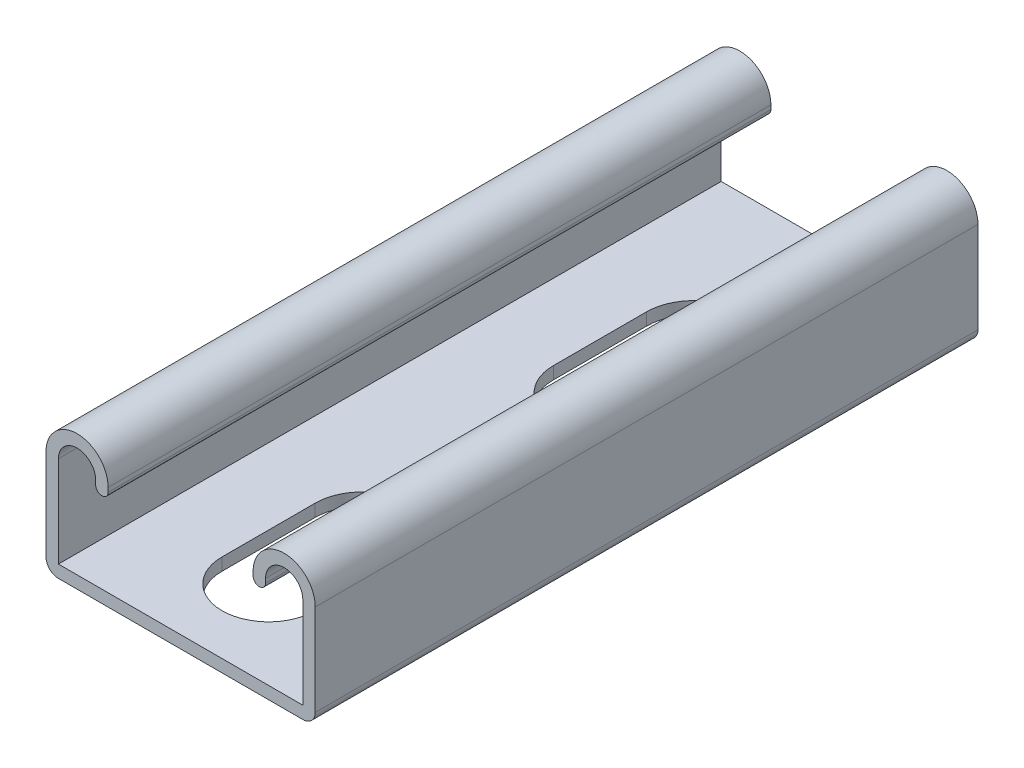
ISO-10303-21;
HEADER;
FILE_DESCRIPTION(('STEP AP214'),'2;1');
FILE_NAME('part.step','',(''),(''),'','','');
FILE_SCHEMA(('AUTOMOTIVE_DESIGN { 1 0 10303 214 1 1 1 1 }'));
ENDSEC;
DATA;
#1=APPLICATION_CONTEXT('core data for automotive mechanical design processes');
#2=APPLICATION_PROTOCOL_DEFINITION('international standard','automotive_design',2000,#1);
#3=PRODUCT_CONTEXT('',#1,'mechanical');
#4=PRODUCT('Part','Part','',(#3));
#5=PRODUCT_RELATED_PRODUCT_CATEGORY('part','',(#4));
#6=PRODUCT_DEFINITION_FORMATION('','',#4);
#7=PRODUCT_DEFINITION_CONTEXT('part definition',#1,'design');
#8=PRODUCT_DEFINITION('design','',#6,#7);
#9=PRODUCT_DEFINITION_SHAPE('','',#8);
#10=(LENGTH_UNIT() NAMED_UNIT(*) SI_UNIT(.MILLI.,.METRE.));
#11=(NAMED_UNIT(*) PLANE_ANGLE_UNIT() SI_UNIT($,.RADIAN.));
#12=(NAMED_UNIT(*) SI_UNIT($,.STERADIAN.) SOLID_ANGLE_UNIT());
#13=UNCERTAINTY_MEASURE_WITH_UNIT(LENGTH_MEASURE(1.E-05),#10,'distance_accuracy_value','');
#14=(GEOMETRIC_REPRESENTATION_CONTEXT(3) GLOBAL_UNCERTAINTY_ASSIGNED_CONTEXT((#13)) GLOBAL_UNIT_ASSIGNED_CONTEXT((#10,
#11,#12)) REPRESENTATION_CONTEXT('',''));
#15=CARTESIAN_POINT('',(0.,0.,0.));
#16=DIRECTION('',(0.,0.,1.));
#17=DIRECTION('',(1.,0.,0.));
#18=AXIS2_PLACEMENT_3D('',#15,#16,#17);
#19=CARTESIAN_POINT('',(-15.875,7.4295,101.6));
#20=DIRECTION('',(0.,0.,-1.));
#21=DIRECTION('',(-1.,0.,0.));
#22=AXIS2_PLACEMENT_3D('',#19,#20,#21);
#23=CYLINDRICAL_SURFACE('',#22,4.7625);
#24=CARTESIAN_POINT('',(-15.875,7.4295,0.));
#25=DIRECTION('',(0.,0.,1.));
#26=DIRECTION('',(-1.,0.,0.));
#27=AXIS2_PLACEMENT_3D('',#24,#25,#26);
#28=CIRCLE('',#27,4.7625);
#29=CARTESIAN_POINT('',(-11.1125,7.4295,0.));
#30=VERTEX_POINT('',#29);
#31=CARTESIAN_POINT('',(-20.6375,7.4295,0.));
#32=VERTEX_POINT('',#31);
#33=EDGE_CURVE('E253',#30,#32,#28,.T.);
#34=ORIENTED_EDGE('',*,*,#33,.T.);
#35=DIRECTION('',(0.,0.,-1.));
#36=VECTOR('',#35,1.);
#37=CARTESIAN_POINT('',(-20.6375,7.4295,101.6));
#38=LINE('',#37,#36);
#39=CARTESIAN_POINT('',(-20.6375,7.4295,101.6));
#40=VERTEX_POINT('',#39);
#41=EDGE_CURVE('E384',#40,#32,#38,.T.);
#42=ORIENTED_EDGE('',*,*,#41,.F.);
#43=CARTESIAN_POINT('',(-15.875,7.4295,101.6));
#44=DIRECTION('',(0.,0.,1.));
#45=DIRECTION('',(-1.,0.,0.));
#46=AXIS2_PLACEMENT_3D('',#43,#44,#45);
#47=CIRCLE('',#46,4.7625);
#48=CARTESIAN_POINT('',(-11.1125,7.4295,101.6));
#49=VERTEX_POINT('',#48);
#50=EDGE_CURVE('E260',#49,#40,#47,.T.);
#51=ORIENTED_EDGE('',*,*,#50,.F.);
#52=DIRECTION('',(0.,0.,-1.));
#53=VECTOR('',#52,1.);
#54=CARTESIAN_POINT('',(-11.1125,7.4295,101.6));
#55=LINE('',#54,#53);
#56=EDGE_CURVE('E298',#49,#30,#55,.T.);
#57=ORIENTED_EDGE('',*,*,#56,.T.);
#58=EDGE_LOOP('',(#34,#42,#51,#57));
#59=FACE_BOUND('',#58,.T.);
#60=ADVANCED_FACE('F32',(#59),#23,.T.);
#61=CARTESIAN_POINT('',(-20.6375,7.4295,101.6));
#62=DIRECTION('',(1.,0.,0.));
#63=DIRECTION('',(0.,0.,-1.));
#64=AXIS2_PLACEMENT_3D('',#61,#62,#63);
#65=PLANE('',#64);
#66=DIRECTION('',(0.,-1.,0.));
#67=VECTOR('',#66,1.);
#68=CARTESIAN_POINT('',(-20.6375,7.4295,0.));
#69=LINE('',#68,#67);
#70=CARTESIAN_POINT('',(-20.6375,-6.5532,0.));
#71=VERTEX_POINT('',#70);
#72=EDGE_CURVE('E301',#32,#71,#69,.T.);
#73=ORIENTED_EDGE('',*,*,#72,.T.);
#74=DIRECTION('',(0.,0.,-1.));
#75=VECTOR('',#74,1.);
#76=CARTESIAN_POINT('',(-20.6375,-6.5532,101.6));
#77=LINE('',#76,#75);
#78=CARTESIAN_POINT('',(-20.6375,-6.5532,101.6));
#79=VERTEX_POINT('',#78);
#80=EDGE_CURVE('E381',#79,#71,#77,.T.);
#81=ORIENTED_EDGE('',*,*,#80,.F.);
#82=DIRECTION('',(0.,-1.,0.));
#83=VECTOR('',#82,1.);
#84=CARTESIAN_POINT('',(-20.6375,7.4295,101.6));
#85=LINE('',#84,#83);
#86=EDGE_CURVE('E263',#40,#79,#85,.T.);
#87=ORIENTED_EDGE('',*,*,#86,.F.);
#88=ORIENTED_EDGE('',*,*,#41,.T.);
#89=EDGE_LOOP('',(#73,#81,#87,#88));
#90=FACE_BOUND('',#89,.T.);
#91=ADVANCED_FACE('F425',(#90),#65,.F.);
#92=CARTESIAN_POINT('',(-18.7325,-6.5532,101.6));
#93=DIRECTION('',(0.,0.,-1.));
#94=DIRECTION('',(-1.,0.,0.));
#95=AXIS2_PLACEMENT_3D('',#92,#93,#94);
#96=CYLINDRICAL_SURFACE('',#95,1.905);
#97=CARTESIAN_POINT('',(-18.7325,-6.5532,0.));
#98=DIRECTION('',(0.,0.,1.));
#99=DIRECTION('',(-1.,0.,0.));
#100=AXIS2_PLACEMENT_3D('',#97,#98,#99);
#101=CIRCLE('',#100,1.905);
#102=CARTESIAN_POINT('',(-18.7325,-8.4582,0.));
#103=VERTEX_POINT('',#102);
#104=EDGE_CURVE('E303',#71,#103,#101,.T.);
#105=ORIENTED_EDGE('',*,*,#104,.T.);
#106=DIRECTION('',(0.,0.,-1.));
#107=VECTOR('',#106,1.);
#108=CARTESIAN_POINT('',(-18.7325,-8.4582,101.6));
#109=LINE('',#108,#107);
#110=CARTESIAN_POINT('',(-18.7325,-8.4582,101.6));
#111=VERTEX_POINT('',#110);
#112=EDGE_CURVE('E378',#111,#103,#109,.T.);
#113=ORIENTED_EDGE('',*,*,#112,.F.);
#114=CARTESIAN_POINT('',(-18.7325,-6.5532,101.6));
#115=DIRECTION('',(0.,0.,1.));
#116=DIRECTION('',(-1.,0.,0.));
#117=AXIS2_PLACEMENT_3D('',#114,#115,#116);
#118=CIRCLE('',#117,1.905);
#119=EDGE_CURVE('E266',#79,#111,#118,.T.);
#120=ORIENTED_EDGE('',*,*,#119,.F.);
#121=ORIENTED_EDGE('',*,*,#80,.T.);
#122=EDGE_LOOP('',(#105,#113,#120,#121));
#123=FACE_BOUND('',#122,.T.);
#124=ADVANCED_FACE('F430',(#123),#96,.T.);
#125=CARTESIAN_POINT('',(-18.7325,-8.4582,101.6));
#126=DIRECTION('',(0.,1.,0.));
#127=DIRECTION('',(0.,0.,1.));
#128=AXIS2_PLACEMENT_3D('',#125,#126,#127);
#129=PLANE('',#128);
#130=DIRECTION('',(0.,0.,-1.));
#131=VECTOR('',#130,1.);
#132=CARTESIAN_POINT('',(-7.14375,-8.45820000000685,73.81875));
#133=LINE('',#132,#131);
#134=CARTESIAN_POINT('',(-7.14375,-8.4582,88.10625));
#135=VERTEX_POINT('',#134);
#136=CARTESIAN_POINT('',(-7.14375,-8.45820000000685,73.81875));
#137=VERTEX_POINT('',#136);
#138=EDGE_CURVE('E206',#135,#137,#133,.T.);
#139=ORIENTED_EDGE('',*,*,#138,.F.);
#140=CARTESIAN_POINT('',(0.,-8.45820000000685,88.10625));
#141=DIRECTION('',(0.,-1.,0.));
#142=DIRECTION('',(0.,0.,-1.));
#143=AXIS2_PLACEMENT_3D('',#140,#141,#142);
#144=CIRCLE('',#143,7.14375);
#145=CARTESIAN_POINT('',(7.14375,-8.45820000000685,88.10625));
#146=VERTEX_POINT('',#145);
#147=EDGE_CURVE('E46',#146,#135,#144,.T.);
#148=ORIENTED_EDGE('',*,*,#147,.F.);
#149=DIRECTION('',(0.,0.,1.));
#150=VECTOR('',#149,1.);
#151=CARTESIAN_POINT('',(7.14375,-8.45820000000685,88.10625));
#152=LINE('',#151,#150);
#153=CARTESIAN_POINT('',(7.14375,-8.45820000000685,73.81875));
#154=VERTEX_POINT('',#153);
#155=EDGE_CURVE('E222',#154,#146,#152,.T.);
#156=ORIENTED_EDGE('',*,*,#155,.F.);
#157=CARTESIAN_POINT('',(0.,-8.45820000000685,73.81875));
#158=DIRECTION('',(0.,-1.,0.));
#159=DIRECTION('',(0.,0.,-1.));
#160=AXIS2_PLACEMENT_3D('',#157,#158,#159);
#161=CIRCLE('',#160,7.14375);
#162=EDGE_CURVE('E216',#137,#154,#161,.T.);
#163=ORIENTED_EDGE('',*,*,#162,.F.);
#164=EDGE_LOOP('',(#139,#148,#156,#163));
#165=FACE_BOUND('',#164,.T.);
#166=DIRECTION('',(0.,0.,-1.));
#167=VECTOR('',#166,1.);
#168=CARTESIAN_POINT('',(-7.14375,-8.45820000000685,23.01875));
#169=LINE('',#168,#167);
#170=CARTESIAN_POINT('',(-7.14375,-8.4582,37.30625));
#171=VERTEX_POINT('',#170);
#172=CARTESIAN_POINT('',(-7.14375,-8.45820000000685,23.01875));
#173=VERTEX_POINT('',#172);
#174=EDGE_CURVE('E241',#171,#173,#169,.T.);
#175=ORIENTED_EDGE('',*,*,#174,.F.);
#176=CARTESIAN_POINT('',(0.,-8.45820000000685,37.30625));
#177=DIRECTION('',(0.,-1.,0.));
#178=DIRECTION('',(0.,0.,-1.));
#179=AXIS2_PLACEMENT_3D('',#176,#177,#178);
#180=CIRCLE('',#179,7.14375);
#181=CARTESIAN_POINT('',(7.14375,-8.45820000000685,37.30625));
#182=VERTEX_POINT('',#181);
#183=EDGE_CURVE('E239',#182,#171,#180,.T.);
#184=ORIENTED_EDGE('',*,*,#183,.F.);
#185=DIRECTION('',(0.,0.,1.));
#186=VECTOR('',#185,1.);
#187=CARTESIAN_POINT('',(7.14375,-8.45820000000685,37.30625));
#188=LINE('',#187,#186);
#189=CARTESIAN_POINT('',(7.14375,-8.45820000000685,23.01875));
#190=VERTEX_POINT('',#189);
#191=EDGE_CURVE('E247',#190,#182,#188,.T.);
#192=ORIENTED_EDGE('',*,*,#191,.F.);
#193=CARTESIAN_POINT('',(0.,-8.45820000000685,23.01875));
#194=DIRECTION('',(0.,-1.,0.));
#195=DIRECTION('',(0.,0.,-1.));
#196=AXIS2_PLACEMENT_3D('',#193,#194,#195);
#197=CIRCLE('',#196,7.14375);
#198=EDGE_CURVE('E244',#173,#190,#197,.T.);
#199=ORIENTED_EDGE('',*,*,#198,.F.);
#200=EDGE_LOOP('',(#175,#184,#192,#199));
#201=FACE_BOUND('',#200,.T.);
#202=DIRECTION('',(1.,0.,0.));
#203=VECTOR('',#202,1.);
#204=CARTESIAN_POINT('',(-18.7325,-8.4582,0.));
#205=LINE('',#204,#203);
#206=CARTESIAN_POINT('',(18.7325,-8.4582,0.));
#207=VERTEX_POINT('',#206);
#208=EDGE_CURVE('E305',#103,#207,#205,.T.);
#209=ORIENTED_EDGE('',*,*,#208,.T.);
#210=DIRECTION('',(0.,0.,-1.));
#211=VECTOR('',#210,1.);
#212=CARTESIAN_POINT('',(18.7325,-8.4582,101.6));
#213=LINE('',#212,#211);
#214=CARTESIAN_POINT('',(18.7325,-8.4582,101.6));
#215=VERTEX_POINT('',#214);
#216=EDGE_CURVE('E375',#215,#207,#213,.T.);
#217=ORIENTED_EDGE('',*,*,#216,.F.);
#218=DIRECTION('',(1.,0.,0.));
#219=VECTOR('',#218,1.);
#220=CARTESIAN_POINT('',(-18.7325,-8.4582,101.6));
#221=LINE('',#220,#219);
#222=EDGE_CURVE('E268',#111,#215,#221,.T.);
#223=ORIENTED_EDGE('',*,*,#222,.F.);
#224=ORIENTED_EDGE('',*,*,#112,.T.);
#225=EDGE_LOOP('',(#209,#217,#223,#224));
#226=FACE_BOUND('',#225,.T.);
#227=ADVANCED_FACE('F220',(#165,#201,#226),#129,.F.);
#228=CARTESIAN_POINT('',(18.7325,-6.5532,101.6));
#229=DIRECTION('',(0.,0.,-1.));
#230=DIRECTION('',(-1.,0.,0.));
#231=AXIS2_PLACEMENT_3D('',#228,#229,#230);
#232=CYLINDRICAL_SURFACE('',#231,1.905);
#233=CARTESIAN_POINT('',(18.7325,-6.5532,0.));
#234=DIRECTION('',(0.,0.,1.));
#235=DIRECTION('',(1.,0.,0.));
#236=AXIS2_PLACEMENT_3D('',#233,#234,#235);
#237=CIRCLE('',#236,1.905);
#238=CARTESIAN_POINT('',(20.6375,-6.5532,0.));
#239=VERTEX_POINT('',#238);
#240=EDGE_CURVE('E307',#207,#239,#237,.T.);
#241=ORIENTED_EDGE('',*,*,#240,.T.);
#242=DIRECTION('',(0.,0.,-1.));
#243=VECTOR('',#242,1.);
#244=CARTESIAN_POINT('',(20.6375,-6.5532,101.6));
#245=LINE('',#244,#243);
#246=CARTESIAN_POINT('',(20.6375,-6.5532,101.6));
#247=VERTEX_POINT('',#246);
#248=EDGE_CURVE('E372',#247,#239,#245,.T.);
#249=ORIENTED_EDGE('',*,*,#248,.F.);
#250=CARTESIAN_POINT('',(18.7325,-6.5532,101.6));
#251=DIRECTION('',(0.,0.,1.));
#252=DIRECTION('',(1.,0.,0.));
#253=AXIS2_PLACEMENT_3D('',#250,#251,#252);
#254=CIRCLE('',#253,1.905);
#255=EDGE_CURVE('E270',#215,#247,#254,.T.);
#256=ORIENTED_EDGE('',*,*,#255,.F.);
#257=ORIENTED_EDGE('',*,*,#216,.T.);
#258=EDGE_LOOP('',(#241,#249,#256,#257));
#259=FACE_BOUND('',#258,.T.);
#260=ADVANCED_FACE('F510',(#259),#232,.T.);
#261=CARTESIAN_POINT('',(20.6375,-6.5532,101.6));
#262=DIRECTION('',(-1.,0.,0.));
#263=DIRECTION('',(0.,-1.,0.));
#264=AXIS2_PLACEMENT_3D('',#261,#262,#263);
#265=PLANE('',#264);
#266=DIRECTION('',(0.,1.,0.));
#267=VECTOR('',#266,1.);
#268=CARTESIAN_POINT('',(20.6375,-6.5532,0.));
#269=LINE('',#268,#267);
#270=CARTESIAN_POINT('',(20.6375,7.4295,0.));
#271=VERTEX_POINT('',#270);
#272=EDGE_CURVE('E309',#239,#271,#269,.T.);
#273=ORIENTED_EDGE('',*,*,#272,.T.);
#274=DIRECTION('',(0.,0.,-1.));
#275=VECTOR('',#274,1.);
#276=CARTESIAN_POINT('',(20.6375,7.4295,101.6));
#277=LINE('',#276,#275);
#278=CARTESIAN_POINT('',(20.6375,7.4295,101.6));
#279=VERTEX_POINT('',#278);
#280=EDGE_CURVE('E369',#279,#271,#277,.T.);
#281=ORIENTED_EDGE('',*,*,#280,.F.);
#282=DIRECTION('',(0.,1.,0.));
#283=VECTOR('',#282,1.);
#284=CARTESIAN_POINT('',(20.6375,-6.5532,101.6));
#285=LINE('',#284,#283);
#286=EDGE_CURVE('E272',#247,#279,#285,.T.);
#287=ORIENTED_EDGE('',*,*,#286,.F.);
#288=ORIENTED_EDGE('',*,*,#248,.T.);
#289=EDGE_LOOP('',(#273,#281,#287,#288));
#290=FACE_BOUND('',#289,.T.);
#291=ADVANCED_FACE('F506',(#290),#265,.F.);
#292=CARTESIAN_POINT('',(15.875,7.4295,101.6));
#293=DIRECTION('',(0.,0.,-1.));
#294=DIRECTION('',(-1.,0.,0.));
#295=AXIS2_PLACEMENT_3D('',#292,#293,#294);
#296=CYLINDRICAL_SURFACE('',#295,4.7625);
#297=CARTESIAN_POINT('',(15.875,7.4295,0.));
#298=DIRECTION('',(0.,0.,1.));
#299=DIRECTION('',(1.,0.,0.));
#300=AXIS2_PLACEMENT_3D('',#297,#298,#299);
#301=CIRCLE('',#300,4.7625);
#302=CARTESIAN_POINT('',(11.1125,7.4295,0.));
#303=VERTEX_POINT('',#302);
#304=EDGE_CURVE('E311',#271,#303,#301,.T.);
#305=ORIENTED_EDGE('',*,*,#304,.T.);
#306=DIRECTION('',(0.,0.,-1.));
#307=VECTOR('',#306,1.);
#308=CARTESIAN_POINT('',(11.1125,7.4295,101.6));
#309=LINE('',#308,#307);
#310=CARTESIAN_POINT('',(11.1125,7.4295,101.6));
#311=VERTEX_POINT('',#310);
#312=EDGE_CURVE('E366',#311,#303,#309,.T.);
#313=ORIENTED_EDGE('',*,*,#312,.F.);
#314=CARTESIAN_POINT('',(15.875,7.4295,101.6));
#315=DIRECTION('',(0.,0.,1.));
#316=DIRECTION('',(1.,0.,0.));
#317=AXIS2_PLACEMENT_3D('',#314,#315,#316);
#318=CIRCLE('',#317,4.7625);
#319=EDGE_CURVE('E274',#279,#311,#318,.T.);
#320=ORIENTED_EDGE('',*,*,#319,.F.);
#321=ORIENTED_EDGE('',*,*,#280,.T.);
#322=EDGE_LOOP('',(#305,#313,#320,#321));
#323=FACE_BOUND('',#322,.T.);
#324=ADVANCED_FACE('F501',(#323),#296,.T.);
#325=CARTESIAN_POINT('',(11.1125,7.4295,101.6));
#326=DIRECTION('',(1.,0.,0.));
#327=DIRECTION('',(0.,1.,0.));
#328=AXIS2_PLACEMENT_3D('',#325,#326,#327);
#329=PLANE('',#328);
#330=DIRECTION('',(0.,-1.,0.));
#331=VECTOR('',#330,1.);
#332=CARTESIAN_POINT('',(11.1125,7.4295,0.));
#333=LINE('',#332,#331);
#334=CARTESIAN_POINT('',(11.1125,6.7945,0.));
#335=VERTEX_POINT('',#334);
#336=EDGE_CURVE('E313',#303,#335,#333,.T.);
#337=ORIENTED_EDGE('',*,*,#336,.T.);
#338=DIRECTION('',(0.,0.,-1.));
#339=VECTOR('',#338,1.);
#340=CARTESIAN_POINT('',(11.1125,6.7945,101.6));
#341=LINE('',#340,#339);
#342=CARTESIAN_POINT('',(11.1125,6.7945,101.6));
#343=VERTEX_POINT('',#342);
#344=EDGE_CURVE('E363',#343,#335,#341,.T.);
#345=ORIENTED_EDGE('',*,*,#344,.F.);
#346=DIRECTION('',(0.,-1.,0.));
#347=VECTOR('',#346,1.);
#348=CARTESIAN_POINT('',(11.1125,7.4295,101.6));
#349=LINE('',#348,#347);
#350=EDGE_CURVE('E276',#311,#343,#349,.T.);
#351=ORIENTED_EDGE('',*,*,#350,.F.);
#352=ORIENTED_EDGE('',*,*,#312,.T.);
#353=EDGE_LOOP('',(#337,#345,#351,#352));
#354=FACE_BOUND('',#353,.T.);
#355=ADVANCED_FACE('F495',(#354),#329,.F.);
#356=CARTESIAN_POINT('',(12.065,6.7945,101.6));
#357=DIRECTION('',(0.,0.,-1.));
#358=DIRECTION('',(-1.,0.,0.));
#359=AXIS2_PLACEMENT_3D('',#356,#357,#358);
#360=CYLINDRICAL_SURFACE('',#359,0.952500000000002);
#361=CARTESIAN_POINT('',(12.065,6.7945,0.));
#362=DIRECTION('',(0.,0.,1.));
#363=DIRECTION('',(1.,0.,0.));
#364=AXIS2_PLACEMENT_3D('',#361,#362,#363);
#365=CIRCLE('',#364,0.952500000000002);
#366=CARTESIAN_POINT('',(13.0175,6.7945,0.));
#367=VERTEX_POINT('',#366);
#368=EDGE_CURVE('E315',#335,#367,#365,.T.);
#369=ORIENTED_EDGE('',*,*,#368,.T.);
#370=DIRECTION('',(0.,0.,-1.));
#371=VECTOR('',#370,1.);
#372=CARTESIAN_POINT('',(13.0175,6.7945,101.6));
#373=LINE('',#372,#371);
#374=CARTESIAN_POINT('',(13.0175,6.7945,101.6));
#375=VERTEX_POINT('',#374);
#376=EDGE_CURVE('E360',#375,#367,#373,.T.);
#377=ORIENTED_EDGE('',*,*,#376,.F.);
#378=CARTESIAN_POINT('',(12.065,6.7945,101.6));
#379=DIRECTION('',(0.,0.,1.));
#380=DIRECTION('',(1.,0.,0.));
#381=AXIS2_PLACEMENT_3D('',#378,#379,#380);
#382=CIRCLE('',#381,0.952500000000002);
#383=EDGE_CURVE('E278',#343,#375,#382,.T.);
#384=ORIENTED_EDGE('',*,*,#383,.F.);
#385=ORIENTED_EDGE('',*,*,#344,.T.);
#386=EDGE_LOOP('',(#369,#377,#384,#385));
#387=FACE_BOUND('',#386,.T.);
#388=ADVANCED_FACE('F491',(#387),#360,.T.);
#389=CARTESIAN_POINT('',(13.0175,7.4295,101.6));
#390=DIRECTION('',(-1.,0.,0.));
#391=DIRECTION('',(0.,-1.,0.));
#392=AXIS2_PLACEMENT_3D('',#389,#390,#391);
#393=PLANE('',#392);
#394=DIRECTION('',(0.,1.,0.));
#395=VECTOR('',#394,1.);
#396=CARTESIAN_POINT('',(13.0175,7.4295,0.));
#397=LINE('',#396,#395);
#398=CARTESIAN_POINT('',(13.0175,7.4295,0.));
#399=VERTEX_POINT('',#398);
#400=EDGE_CURVE('E317',#367,#399,#397,.T.);
#401=ORIENTED_EDGE('',*,*,#400,.T.);
#402=DIRECTION('',(0.,0.,-1.));
#403=VECTOR('',#402,1.);
#404=CARTESIAN_POINT('',(13.0175,7.4295,101.6));
#405=LINE('',#404,#403);
#406=CARTESIAN_POINT('',(13.0175,7.4295,101.6));
#407=VERTEX_POINT('',#406);
#408=EDGE_CURVE('E357',#407,#399,#405,.T.);
#409=ORIENTED_EDGE('',*,*,#408,.F.);
#410=DIRECTION('',(0.,1.,0.));
#411=VECTOR('',#410,1.);
#412=CARTESIAN_POINT('',(13.0175,7.4295,101.6));
#413=LINE('',#412,#411);
#414=EDGE_CURVE('E280',#375,#407,#413,.T.);
#415=ORIENTED_EDGE('',*,*,#414,.F.);
#416=ORIENTED_EDGE('',*,*,#376,.T.);
#417=EDGE_LOOP('',(#401,#409,#415,#416));
#418=FACE_BOUND('',#417,.T.);
#419=ADVANCED_FACE('F486',(#418),#393,.F.);
#420=CARTESIAN_POINT('',(15.875,7.4295,101.6));
#421=DIRECTION('',(0.,0.,-1.));
#422=DIRECTION('',(-1.,0.,0.));
#423=AXIS2_PLACEMENT_3D('',#420,#421,#422);
#424=CYLINDRICAL_SURFACE('',#423,2.8575);
#425=CARTESIAN_POINT('',(15.875,7.4295,0.));
#426=DIRECTION('',(0.,0.,-1.));
#427=DIRECTION('',(1.,0.,0.));
#428=AXIS2_PLACEMENT_3D('',#425,#426,#427);
#429=CIRCLE('',#428,2.8575);
#430=CARTESIAN_POINT('',(18.7325,7.4295,0.));
#431=VERTEX_POINT('',#430);
#432=EDGE_CURVE('E319',#399,#431,#429,.T.);
#433=ORIENTED_EDGE('',*,*,#432,.T.);
#434=DIRECTION('',(0.,0.,-1.));
#435=VECTOR('',#434,1.);
#436=CARTESIAN_POINT('',(18.7325,7.4295,101.6));
#437=LINE('',#436,#435);
#438=CARTESIAN_POINT('',(18.7325,7.4295,101.6));
#439=VERTEX_POINT('',#438);
#440=EDGE_CURVE('E354',#439,#431,#437,.T.);
#441=ORIENTED_EDGE('',*,*,#440,.F.);
#442=CARTESIAN_POINT('',(15.875,7.4295,101.6));
#443=DIRECTION('',(0.,0.,-1.));
#444=DIRECTION('',(1.,0.,0.));
#445=AXIS2_PLACEMENT_3D('',#442,#443,#444);
#446=CIRCLE('',#445,2.8575);
#447=EDGE_CURVE('E282',#407,#439,#446,.T.);
#448=ORIENTED_EDGE('',*,*,#447,.F.);
#449=ORIENTED_EDGE('',*,*,#408,.T.);
#450=EDGE_LOOP('',(#433,#441,#448,#449));
#451=FACE_BOUND('',#450,.T.);
#452=ADVANCED_FACE('F480',(#451),#424,.F.);
#453=CARTESIAN_POINT('',(18.7325,-6.5532,101.6));
#454=DIRECTION('',(1.,0.,0.));
#455=DIRECTION('',(0.,1.,0.));
#456=AXIS2_PLACEMENT_3D('',#453,#454,#455);
#457=PLANE('',#456);
#458=DIRECTION('',(0.,-1.,0.));
#459=VECTOR('',#458,1.);
#460=CARTESIAN_POINT('',(18.7325,-6.5532,0.));
#461=LINE('',#460,#459);
#462=CARTESIAN_POINT('',(18.7325,-6.5532,0.));
#463=VERTEX_POINT('',#462);
#464=EDGE_CURVE('E321',#431,#463,#461,.T.);
#465=ORIENTED_EDGE('',*,*,#464,.T.);
#466=DIRECTION('',(0.,0.,-1.));
#467=VECTOR('',#466,1.);
#468=CARTESIAN_POINT('',(18.7325,-6.5532,101.6));
#469=LINE('',#468,#467);
#470=CARTESIAN_POINT('',(18.7325,-6.5532,101.6));
#471=VERTEX_POINT('',#470);
#472=EDGE_CURVE('E351',#471,#463,#469,.T.);
#473=ORIENTED_EDGE('',*,*,#472,.F.);
#474=DIRECTION('',(0.,-1.,0.));
#475=VECTOR('',#474,1.);
#476=CARTESIAN_POINT('',(18.7325,-6.5532,101.6));
#477=LINE('',#476,#475);
#478=EDGE_CURVE('E284',#439,#471,#477,.T.);
#479=ORIENTED_EDGE('',*,*,#478,.F.);
#480=ORIENTED_EDGE('',*,*,#440,.T.);
#481=EDGE_LOOP('',(#465,#473,#479,#480));
#482=FACE_BOUND('',#481,.T.);
#483=ADVANCED_FACE('F476',(#482),#457,.F.);
#484=CARTESIAN_POINT('',(-18.7325,-6.5532,101.6));
#485=DIRECTION('',(0.,-1.,0.));
#486=DIRECTION('',(0.,0.,-1.));
#487=AXIS2_PLACEMENT_3D('',#484,#485,#486);
#488=PLANE('',#487);
#489=DIRECTION('',(0.,0.,1.));
#490=VECTOR('',#489,1.);
#491=CARTESIAN_POINT('',(7.14375,-6.5532,152.4));
#492=LINE('',#491,#490);
#493=CARTESIAN_POINT('',(7.14375,-6.5532,73.81875));
#494=VERTEX_POINT('',#493);
#495=CARTESIAN_POINT('',(7.14375,-6.5532,88.10625));
#496=VERTEX_POINT('',#495);
#497=EDGE_CURVE('E232',#494,#496,#492,.T.);
#498=ORIENTED_EDGE('',*,*,#497,.T.);
#499=CARTESIAN_POINT('',(0.,-6.5532,88.10625));
#500=DIRECTION('',(0.,-1.,0.));
#501=DIRECTION('',(0.,0.,-1.));
#502=AXIS2_PLACEMENT_3D('',#499,#500,#501);
#503=CIRCLE('',#502,7.14375);
#504=CARTESIAN_POINT('',(-7.14375,-6.5532,88.10625));
#505=VERTEX_POINT('',#504);
#506=EDGE_CURVE('E236',#496,#505,#503,.T.);
#507=ORIENTED_EDGE('',*,*,#506,.T.);
#508=DIRECTION('',(0.,0.,-1.));
#509=VECTOR('',#508,1.);
#510=CARTESIAN_POINT('',(-7.14375,-6.5532,152.4));
#511=LINE('',#510,#509);
#512=CARTESIAN_POINT('',(-7.14375,-6.5532,73.81875));
#513=VERTEX_POINT('',#512);
#514=EDGE_CURVE('E213',#505,#513,#511,.T.);
#515=ORIENTED_EDGE('',*,*,#514,.T.);
#516=CARTESIAN_POINT('',(0.,-6.5532,73.81875));
#517=DIRECTION('',(0.,-1.,0.));
#518=DIRECTION('',(0.,0.,-1.));
#519=AXIS2_PLACEMENT_3D('',#516,#517,#518);
#520=CIRCLE('',#519,7.14375);
#521=EDGE_CURVE('E54',#513,#494,#520,.T.);
#522=ORIENTED_EDGE('',*,*,#521,.T.);
#523=EDGE_LOOP('',(#498,#507,#515,#522));
#524=FACE_BOUND('',#523,.T.);
#525=DIRECTION('',(0.,0.,1.));
#526=VECTOR('',#525,1.);
#527=CARTESIAN_POINT('',(7.14375,-6.5532,101.6));
#528=LINE('',#527,#526);
#529=CARTESIAN_POINT('',(7.14375,-6.5532,23.01875));
#530=VERTEX_POINT('',#529);
#531=CARTESIAN_POINT('',(7.14375,-6.5532,37.30625));
#532=VERTEX_POINT('',#531);
#533=EDGE_CURVE('E39',#530,#532,#528,.T.);
#534=ORIENTED_EDGE('',*,*,#533,.T.);
#535=CARTESIAN_POINT('',(0.,-6.5532,37.30625));
#536=DIRECTION('',(0.,-1.,0.));
#537=DIRECTION('',(0.,0.,-1.));
#538=AXIS2_PLACEMENT_3D('',#535,#536,#537);
#539=CIRCLE('',#538,7.14375);
#540=CARTESIAN_POINT('',(-7.14375,-6.5532,37.30625));
#541=VERTEX_POINT('',#540);
#542=EDGE_CURVE('E11',#532,#541,#539,.T.);
#543=ORIENTED_EDGE('',*,*,#542,.T.);
#544=DIRECTION('',(0.,0.,-1.));
#545=VECTOR('',#544,1.);
#546=CARTESIAN_POINT('',(-7.14375,-6.5532,101.6));
#547=LINE('',#546,#545);
#548=CARTESIAN_POINT('',(-7.14375,-6.5532,23.01875));
#549=VERTEX_POINT('',#548);
#550=EDGE_CURVE('E387',#541,#549,#547,.T.);
#551=ORIENTED_EDGE('',*,*,#550,.T.);
#552=CARTESIAN_POINT('',(0.,-6.5532,23.01875));
#553=DIRECTION('',(0.,-1.,0.));
#554=DIRECTION('',(0.,0.,-1.));
#555=AXIS2_PLACEMENT_3D('',#552,#553,#554);
#556=CIRCLE('',#555,7.14375);
#557=EDGE_CURVE('E390',#549,#530,#556,.T.);
#558=ORIENTED_EDGE('',*,*,#557,.T.);
#559=EDGE_LOOP('',(#534,#543,#551,#558));
#560=FACE_BOUND('',#559,.T.);
#561=DIRECTION('',(-1.,0.,0.));
#562=VECTOR('',#561,1.);
#563=CARTESIAN_POINT('',(-18.7325,-6.5532,0.));
#564=LINE('',#563,#562);
#565=CARTESIAN_POINT('',(-18.7325,-6.5532,0.));
#566=VERTEX_POINT('',#565);
#567=EDGE_CURVE('E323',#463,#566,#564,.T.);
#568=ORIENTED_EDGE('',*,*,#567,.T.);
#569=DIRECTION('',(0.,0.,-1.));
#570=VECTOR('',#569,1.);
#571=CARTESIAN_POINT('',(-18.7325,-6.5532,101.6));
#572=LINE('',#571,#570);
#573=CARTESIAN_POINT('',(-18.7325,-6.5532,101.6));
#574=VERTEX_POINT('',#573);
#575=EDGE_CURVE('E348',#574,#566,#572,.T.);
#576=ORIENTED_EDGE('',*,*,#575,.F.);
#577=DIRECTION('',(-1.,0.,0.));
#578=VECTOR('',#577,1.);
#579=CARTESIAN_POINT('',(-18.7325,-6.5532,101.6));
#580=LINE('',#579,#578);
#581=EDGE_CURVE('E286',#471,#574,#580,.T.);
#582=ORIENTED_EDGE('',*,*,#581,.F.);
#583=ORIENTED_EDGE('',*,*,#472,.T.);
#584=EDGE_LOOP('',(#568,#576,#582,#583));
#585=FACE_BOUND('',#584,.T.);
#586=ADVANCED_FACE('F394',(#524,#560,#585),#488,.F.);
#587=CARTESIAN_POINT('',(-18.7325,7.4295,101.6));
#588=DIRECTION('',(-1.,0.,0.));
#589=DIRECTION('',(0.,0.,1.));
#590=AXIS2_PLACEMENT_3D('',#587,#588,#589);
#591=PLANE('',#590);
#592=DIRECTION('',(0.,1.,0.));
#593=VECTOR('',#592,1.);
#594=CARTESIAN_POINT('',(-18.7325,7.4295,0.));
#595=LINE('',#594,#593);
#596=CARTESIAN_POINT('',(-18.7325,7.4295,0.));
#597=VERTEX_POINT('',#596);
#598=EDGE_CURVE('E325',#566,#597,#595,.T.);
#599=ORIENTED_EDGE('',*,*,#598,.T.);
#600=DIRECTION('',(0.,0.,-1.));
#601=VECTOR('',#600,1.);
#602=CARTESIAN_POINT('',(-18.7325,7.4295,101.6));
#603=LINE('',#602,#601);
#604=CARTESIAN_POINT('',(-18.7325,7.4295,101.6));
#605=VERTEX_POINT('',#604);
#606=EDGE_CURVE('E345',#605,#597,#603,.T.);
#607=ORIENTED_EDGE('',*,*,#606,.F.);
#608=DIRECTION('',(0.,1.,0.));
#609=VECTOR('',#608,1.);
#610=CARTESIAN_POINT('',(-18.7325,7.4295,101.6));
#611=LINE('',#610,#609);
#612=EDGE_CURVE('E288',#574,#605,#611,.T.);
#613=ORIENTED_EDGE('',*,*,#612,.F.);
#614=ORIENTED_EDGE('',*,*,#575,.T.);
#615=EDGE_LOOP('',(#599,#607,#613,#614));
#616=FACE_BOUND('',#615,.T.);
#617=ADVANCED_FACE('F467',(#616),#591,.F.);
#618=CARTESIAN_POINT('',(-15.875,7.4295,101.6));
#619=DIRECTION('',(0.,0.,-1.));
#620=DIRECTION('',(-1.,0.,0.));
#621=AXIS2_PLACEMENT_3D('',#618,#619,#620);
#622=CYLINDRICAL_SURFACE('',#621,2.8575);
#623=CARTESIAN_POINT('',(-15.875,7.4295,0.));
#624=DIRECTION('',(0.,0.,-1.));
#625=DIRECTION('',(-1.,0.,0.));
#626=AXIS2_PLACEMENT_3D('',#623,#624,#625);
#627=CIRCLE('',#626,2.8575);
#628=CARTESIAN_POINT('',(-13.0175,7.4295,0.));
#629=VERTEX_POINT('',#628);
#630=EDGE_CURVE('E327',#597,#629,#627,.T.);
#631=ORIENTED_EDGE('',*,*,#630,.T.);
#632=DIRECTION('',(0.,0.,-1.));
#633=VECTOR('',#632,1.);
#634=CARTESIAN_POINT('',(-13.0175,7.4295,101.6));
#635=LINE('',#634,#633);
#636=CARTESIAN_POINT('',(-13.0175,7.4295,101.6));
#637=VERTEX_POINT('',#636);
#638=EDGE_CURVE('E342',#637,#629,#635,.T.);
#639=ORIENTED_EDGE('',*,*,#638,.F.);
#640=CARTESIAN_POINT('',(-15.875,7.4295,101.6));
#641=DIRECTION('',(0.,0.,-1.));
#642=DIRECTION('',(-1.,0.,0.));
#643=AXIS2_PLACEMENT_3D('',#640,#641,#642);
#644=CIRCLE('',#643,2.8575);
#645=EDGE_CURVE('E290',#605,#637,#644,.T.);
#646=ORIENTED_EDGE('',*,*,#645,.F.);
#647=ORIENTED_EDGE('',*,*,#606,.T.);
#648=EDGE_LOOP('',(#631,#639,#646,#647));
#649=FACE_BOUND('',#648,.T.);
#650=ADVANCED_FACE('F463',(#649),#622,.F.);
#651=CARTESIAN_POINT('',(-13.0175,7.4295,101.6));
#652=DIRECTION('',(1.,0.,0.));
#653=DIRECTION('',(0.,1.,0.));
#654=AXIS2_PLACEMENT_3D('',#651,#652,#653);
#655=PLANE('',#654);
#656=DIRECTION('',(0.,-1.,0.));
#657=VECTOR('',#656,1.);
#658=CARTESIAN_POINT('',(-13.0175,7.4295,0.));
#659=LINE('',#658,#657);
#660=CARTESIAN_POINT('',(-13.0175,6.7945,0.));
#661=VERTEX_POINT('',#660);
#662=EDGE_CURVE('E329',#629,#661,#659,.T.);
#663=ORIENTED_EDGE('',*,*,#662,.T.);
#664=DIRECTION('',(0.,0.,-1.));
#665=VECTOR('',#664,1.);
#666=CARTESIAN_POINT('',(-13.0175,6.7945,101.6));
#667=LINE('',#666,#665);
#668=CARTESIAN_POINT('',(-13.0175,6.7945,101.6));
#669=VERTEX_POINT('',#668);
#670=EDGE_CURVE('E339',#669,#661,#667,.T.);
#671=ORIENTED_EDGE('',*,*,#670,.F.);
#672=DIRECTION('',(0.,-1.,0.));
#673=VECTOR('',#672,1.);
#674=CARTESIAN_POINT('',(-13.0175,7.4295,101.6));
#675=LINE('',#674,#673);
#676=EDGE_CURVE('E292',#637,#669,#675,.T.);
#677=ORIENTED_EDGE('',*,*,#676,.F.);
#678=ORIENTED_EDGE('',*,*,#638,.T.);
#679=EDGE_LOOP('',(#663,#671,#677,#678));
#680=FACE_BOUND('',#679,.T.);
#681=ADVANCED_FACE('F458',(#680),#655,.F.);
#682=CARTESIAN_POINT('',(-12.065,6.7945,101.6));
#683=DIRECTION('',(0.,0.,-1.));
#684=DIRECTION('',(-1.,0.,0.));
#685=AXIS2_PLACEMENT_3D('',#682,#683,#684);
#686=CYLINDRICAL_SURFACE('',#685,0.952499999999999);
#687=CARTESIAN_POINT('',(-12.065,6.7945,0.));
#688=DIRECTION('',(0.,0.,1.));
#689=DIRECTION('',(-1.,0.,0.));
#690=AXIS2_PLACEMENT_3D('',#687,#688,#689);
#691=CIRCLE('',#690,0.952499999999999);
#692=CARTESIAN_POINT('',(-11.1125,6.7945,0.));
#693=VERTEX_POINT('',#692);
#694=EDGE_CURVE('E331',#661,#693,#691,.T.);
#695=ORIENTED_EDGE('',*,*,#694,.T.);
#696=DIRECTION('',(0.,0.,-1.));
#697=VECTOR('',#696,1.);
#698=CARTESIAN_POINT('',(-11.1125,6.7945,101.6));
#699=LINE('',#698,#697);
#700=CARTESIAN_POINT('',(-11.1125,6.7945,101.6));
#701=VERTEX_POINT('',#700);
#702=EDGE_CURVE('E336',#701,#693,#699,.T.);
#703=ORIENTED_EDGE('',*,*,#702,.F.);
#704=CARTESIAN_POINT('',(-12.065,6.7945,101.6));
#705=DIRECTION('',(0.,0.,1.));
#706=DIRECTION('',(-1.,0.,0.));
#707=AXIS2_PLACEMENT_3D('',#704,#705,#706);
#708=CIRCLE('',#707,0.952499999999999);
#709=EDGE_CURVE('E294',#669,#701,#708,.T.);
#710=ORIENTED_EDGE('',*,*,#709,.F.);
#711=ORIENTED_EDGE('',*,*,#670,.T.);
#712=EDGE_LOOP('',(#695,#703,#710,#711));
#713=FACE_BOUND('',#712,.T.);
#714=ADVANCED_FACE('F452',(#713),#686,.T.);
#715=CARTESIAN_POINT('',(-11.1125,7.4295,101.6));
#716=DIRECTION('',(-1.,0.,0.));
#717=DIRECTION('',(0.,-1.,0.));
#718=AXIS2_PLACEMENT_3D('',#715,#716,#717);
#719=PLANE('',#718);
#720=DIRECTION('',(0.,1.,0.));
#721=VECTOR('',#720,1.);
#722=CARTESIAN_POINT('',(-11.1125,7.4295,0.));
#723=LINE('',#722,#721);
#724=EDGE_CURVE('E264',#693,#30,#723,.T.);
#725=ORIENTED_EDGE('',*,*,#724,.T.);
#726=ORIENTED_EDGE('',*,*,#56,.F.);
#727=DIRECTION('',(0.,1.,0.));
#728=VECTOR('',#727,1.);
#729=CARTESIAN_POINT('',(-11.1125,7.4295,101.6));
#730=LINE('',#729,#728);
#731=EDGE_CURVE('E296',#701,#49,#730,.T.);
#732=ORIENTED_EDGE('',*,*,#731,.F.);
#733=ORIENTED_EDGE('',*,*,#702,.T.);
#734=EDGE_LOOP('',(#725,#726,#732,#733));
#735=FACE_BOUND('',#734,.T.);
#736=ADVANCED_FACE('F450',(#735),#719,.F.);
#737=CARTESIAN_POINT('',(-15.875,7.4295,101.6));
#738=DIRECTION('',(0.,0.,-1.));
#739=DIRECTION('',(-1.,0.,0.));
#740=AXIS2_PLACEMENT_3D('',#737,#738,#739);
#741=PLANE('',#740);
#742=ORIENTED_EDGE('',*,*,#50,.T.);
#743=ORIENTED_EDGE('',*,*,#86,.T.);
#744=ORIENTED_EDGE('',*,*,#119,.T.);
#745=ORIENTED_EDGE('',*,*,#222,.T.);
#746=ORIENTED_EDGE('',*,*,#255,.T.);
#747=ORIENTED_EDGE('',*,*,#286,.T.);
#748=ORIENTED_EDGE('',*,*,#319,.T.);
#749=ORIENTED_EDGE('',*,*,#350,.T.);
#750=ORIENTED_EDGE('',*,*,#383,.T.);
#751=ORIENTED_EDGE('',*,*,#414,.T.);
#752=ORIENTED_EDGE('',*,*,#447,.T.);
#753=ORIENTED_EDGE('',*,*,#478,.T.);
#754=ORIENTED_EDGE('',*,*,#581,.T.);
#755=ORIENTED_EDGE('',*,*,#612,.T.);
#756=ORIENTED_EDGE('',*,*,#645,.T.);
#757=ORIENTED_EDGE('',*,*,#676,.T.);
#758=ORIENTED_EDGE('',*,*,#709,.T.);
#759=ORIENTED_EDGE('',*,*,#731,.T.);
#760=EDGE_LOOP('',(#742,#743,#744,#745,#746,#747,#748,#749,#750,#751,#752,#753,#754,#755,#756,
#757,#758,#759));
#761=FACE_BOUND('',#760,.T.);
#762=ADVANCED_FACE('F445',(#761),#741,.F.);
#763=CARTESIAN_POINT('',(-15.875,7.4295,0.));
#764=DIRECTION('',(0.,0.,-1.));
#765=DIRECTION('',(-1.,0.,0.));
#766=AXIS2_PLACEMENT_3D('',#763,#764,#765);
#767=PLANE('',#766);
#768=ORIENTED_EDGE('',*,*,#33,.F.);
#769=ORIENTED_EDGE('',*,*,#724,.F.);
#770=ORIENTED_EDGE('',*,*,#694,.F.);
#771=ORIENTED_EDGE('',*,*,#662,.F.);
#772=ORIENTED_EDGE('',*,*,#630,.F.);
#773=ORIENTED_EDGE('',*,*,#598,.F.);
#774=ORIENTED_EDGE('',*,*,#567,.F.);
#775=ORIENTED_EDGE('',*,*,#464,.F.);
#776=ORIENTED_EDGE('',*,*,#432,.F.);
#777=ORIENTED_EDGE('',*,*,#400,.F.);
#778=ORIENTED_EDGE('',*,*,#368,.F.);
#779=ORIENTED_EDGE('',*,*,#336,.F.);
#780=ORIENTED_EDGE('',*,*,#304,.F.);
#781=ORIENTED_EDGE('',*,*,#272,.F.);
#782=ORIENTED_EDGE('',*,*,#240,.F.);
#783=ORIENTED_EDGE('',*,*,#208,.F.);
#784=ORIENTED_EDGE('',*,*,#104,.F.);
#785=ORIENTED_EDGE('',*,*,#72,.F.);
#786=EDGE_LOOP('',(#768,#769,#770,#771,#772,#773,#774,#775,#776,#777,#778,#779,#780,#781,#782,
#783,#784,#785));
#787=FACE_BOUND('',#786,.T.);
#788=ADVANCED_FACE('F438',(#787),#767,.T.);
#789=CARTESIAN_POINT('',(0.,12.192,37.30625));
#790=DIRECTION('',(0.,-1.,0.));
#791=DIRECTION('',(0.,0.,-1.));
#792=AXIS2_PLACEMENT_3D('',#789,#790,#791);
#793=CYLINDRICAL_SURFACE('',#792,7.14375);
#794=DIRECTION('',(0.,-1.,0.));
#795=VECTOR('',#794,1.);
#796=CARTESIAN_POINT('',(7.14375,12.192,37.30625));
#797=LINE('',#796,#795);
#798=EDGE_CURVE('E251',#532,#182,#797,.T.);
#799=ORIENTED_EDGE('',*,*,#798,.T.);
#800=ORIENTED_EDGE('',*,*,#183,.T.);
#801=DIRECTION('',(0.,-1.,0.));
#802=VECTOR('',#801,1.);
#803=CARTESIAN_POINT('',(-7.14375,12.192,37.30625));
#804=LINE('',#803,#802);
#805=EDGE_CURVE('E250',#541,#171,#804,.T.);
#806=ORIENTED_EDGE('',*,*,#805,.F.);
#807=ORIENTED_EDGE('',*,*,#542,.F.);
#808=EDGE_LOOP('',(#799,#800,#806,#807));
#809=FACE_BOUND('',#808,.T.);
#810=ADVANCED_FACE('F410',(#809),#793,.F.);
#811=CARTESIAN_POINT('',(7.14375,12.192,37.30625));
#812=DIRECTION('',(1.,0.,0.));
#813=DIRECTION('',(0.,0.,-1.));
#814=AXIS2_PLACEMENT_3D('',#811,#812,#813);
#815=PLANE('',#814);
#816=DIRECTION('',(0.,-1.,0.));
#817=VECTOR('',#816,1.);
#818=CARTESIAN_POINT('',(7.14375,12.192,23.01875));
#819=LINE('',#818,#817);
#820=EDGE_CURVE('E254',#530,#190,#819,.T.);
#821=ORIENTED_EDGE('',*,*,#820,.T.);
#822=ORIENTED_EDGE('',*,*,#191,.T.);
#823=ORIENTED_EDGE('',*,*,#798,.F.);
#824=ORIENTED_EDGE('',*,*,#533,.F.);
#825=EDGE_LOOP('',(#821,#822,#823,#824));
#826=FACE_BOUND('',#825,.T.);
#827=ADVANCED_FACE('F400',(#826),#815,.F.);
#828=CARTESIAN_POINT('',(0.,12.192,23.01875));
#829=DIRECTION('',(0.,-1.,0.));
#830=DIRECTION('',(0.,0.,-1.));
#831=AXIS2_PLACEMENT_3D('',#828,#829,#830);
#832=CYLINDRICAL_SURFACE('',#831,7.14375);
#833=DIRECTION('',(0.,-1.,0.));
#834=VECTOR('',#833,1.);
#835=CARTESIAN_POINT('',(-7.14375,12.192,23.01875));
#836=LINE('',#835,#834);
#837=EDGE_CURVE('E256',#549,#173,#836,.T.);
#838=ORIENTED_EDGE('',*,*,#837,.T.);
#839=ORIENTED_EDGE('',*,*,#198,.T.);
#840=ORIENTED_EDGE('',*,*,#820,.F.);
#841=ORIENTED_EDGE('',*,*,#557,.F.);
#842=EDGE_LOOP('',(#838,#839,#840,#841));
#843=FACE_BOUND('',#842,.T.);
#844=ADVANCED_FACE('F402',(#843),#832,.F.);
#845=CARTESIAN_POINT('',(-7.14375,12.192,23.01875));
#846=DIRECTION('',(-1.,0.,0.));
#847=DIRECTION('',(0.,0.,1.));
#848=AXIS2_PLACEMENT_3D('',#845,#846,#847);
#849=PLANE('',#848);
#850=ORIENTED_EDGE('',*,*,#805,.T.);
#851=ORIENTED_EDGE('',*,*,#174,.T.);
#852=ORIENTED_EDGE('',*,*,#837,.F.);
#853=ORIENTED_EDGE('',*,*,#550,.F.);
#854=EDGE_LOOP('',(#850,#851,#852,#853));
#855=FACE_BOUND('',#854,.T.);
#856=ADVANCED_FACE('F412',(#855),#849,.F.);
#857=CARTESIAN_POINT('',(0.,12.192,88.10625));
#858=DIRECTION('',(0.,-1.,0.));
#859=DIRECTION('',(0.,0.,-1.));
#860=AXIS2_PLACEMENT_3D('',#857,#858,#859);
#861=CYLINDRICAL_SURFACE('',#860,7.14375);
#862=DIRECTION('',(0.,-1.,0.));
#863=VECTOR('',#862,1.);
#864=CARTESIAN_POINT('',(7.14375,12.192,88.10625));
#865=LINE('',#864,#863);
#866=EDGE_CURVE('E230',#496,#146,#865,.T.);
#867=ORIENTED_EDGE('',*,*,#866,.T.);
#868=ORIENTED_EDGE('',*,*,#147,.T.);
#869=DIRECTION('',(0.,-1.,0.));
#870=VECTOR('',#869,1.);
#871=CARTESIAN_POINT('',(-7.14375,12.192,88.10625));
#872=LINE('',#871,#870);
#873=EDGE_CURVE('E210',#505,#135,#872,.T.);
#874=ORIENTED_EDGE('',*,*,#873,.F.);
#875=ORIENTED_EDGE('',*,*,#506,.F.);
#876=EDGE_LOOP('',(#867,#868,#874,#875));
#877=FACE_BOUND('',#876,.T.);
#878=ADVANCED_FACE('F414',(#877),#861,.F.);
#879=CARTESIAN_POINT('',(7.14375,12.192,88.10625));
#880=DIRECTION('',(1.,0.,0.));
#881=DIRECTION('',(0.,0.,-1.));
#882=AXIS2_PLACEMENT_3D('',#879,#880,#881);
#883=PLANE('',#882);
#884=DIRECTION('',(0.,-1.,0.));
#885=VECTOR('',#884,1.);
#886=CARTESIAN_POINT('',(7.14375,12.192,73.81875));
#887=LINE('',#886,#885);
#888=EDGE_CURVE('E223',#494,#154,#887,.T.);
#889=ORIENTED_EDGE('',*,*,#888,.T.);
#890=ORIENTED_EDGE('',*,*,#155,.T.);
#891=ORIENTED_EDGE('',*,*,#866,.F.);
#892=ORIENTED_EDGE('',*,*,#497,.F.);
#893=EDGE_LOOP('',(#889,#890,#891,#892));
#894=FACE_BOUND('',#893,.T.);
#895=ADVANCED_FACE('F420',(#894),#883,.F.);
#896=CARTESIAN_POINT('',(0.,12.192,73.81875));
#897=DIRECTION('',(0.,-1.,0.));
#898=DIRECTION('',(0.,0.,-1.));
#899=AXIS2_PLACEMENT_3D('',#896,#897,#898);
#900=CYLINDRICAL_SURFACE('',#899,7.14375);
#901=DIRECTION('',(0.,-1.,0.));
#902=VECTOR('',#901,1.);
#903=CARTESIAN_POINT('',(-7.14375,12.192,73.81875));
#904=LINE('',#903,#902);
#905=EDGE_CURVE('E208',#513,#137,#904,.T.);
#906=ORIENTED_EDGE('',*,*,#905,.T.);
#907=ORIENTED_EDGE('',*,*,#162,.T.);
#908=ORIENTED_EDGE('',*,*,#888,.F.);
#909=ORIENTED_EDGE('',*,*,#521,.F.);
#910=EDGE_LOOP('',(#906,#907,#908,#909));
#911=FACE_BOUND('',#910,.T.);
#912=ADVANCED_FACE('F215',(#911),#900,.F.);
#913=CARTESIAN_POINT('',(-7.14375,12.192,73.81875));
#914=DIRECTION('',(-1.,0.,0.));
#915=DIRECTION('',(0.,0.,1.));
#916=AXIS2_PLACEMENT_3D('',#913,#914,#915);
#917=PLANE('',#916);
#918=ORIENTED_EDGE('',*,*,#873,.T.);
#919=ORIENTED_EDGE('',*,*,#138,.T.);
#920=ORIENTED_EDGE('',*,*,#905,.F.);
#921=ORIENTED_EDGE('',*,*,#514,.F.);
#922=EDGE_LOOP('',(#918,#919,#920,#921));
#923=FACE_BOUND('',#922,.T.);
#924=ADVANCED_FACE('F207',(#923),#917,.F.);
#925=CLOSED_SHELL('',(#60,#91,#124,#227,#260,#291,#324,#355,#388,#419,#452,#483,#586,#617,#650,
#681,#714,#736,#762,#788,#810,#827,#844,#856,#878,#895,#912,#924));
#926=MANIFOLD_SOLID_BREP('B2',#925);
#927=ADVANCED_BREP_SHAPE_REPRESENTATION('',(#18,#926),#14);
#928=SHAPE_DEFINITION_REPRESENTATION(#9,#927);
ENDSEC;
END-ISO-10303-21;
